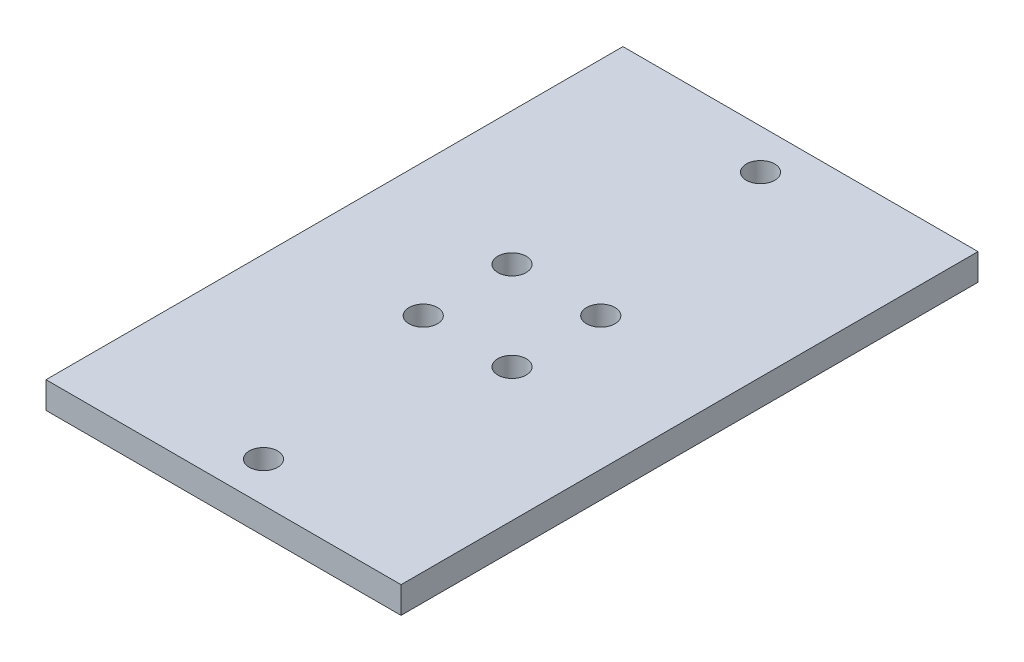
ISO-10303-21;
HEADER;
FILE_DESCRIPTION(('STEP AP214'),'2;1');
FILE_NAME('part.step','',(''),(''),'','','');
FILE_SCHEMA(('AUTOMOTIVE_DESIGN { 1 0 10303 214 1 1 1 1 }'));
ENDSEC;
DATA;
#1=APPLICATION_CONTEXT('core data for automotive mechanical design processes');
#2=APPLICATION_PROTOCOL_DEFINITION('international standard','automotive_design',2000,#1);
#3=PRODUCT_CONTEXT('',#1,'mechanical');
#4=PRODUCT('Part','Part','',(#3));
#5=PRODUCT_RELATED_PRODUCT_CATEGORY('part','',(#4));
#6=PRODUCT_DEFINITION_FORMATION('','',#4);
#7=PRODUCT_DEFINITION_CONTEXT('part definition',#1,'design');
#8=PRODUCT_DEFINITION('design','',#6,#7);
#9=PRODUCT_DEFINITION_SHAPE('','',#8);
#10=(LENGTH_UNIT() NAMED_UNIT(*) SI_UNIT(.MILLI.,.METRE.));
#11=(NAMED_UNIT(*) PLANE_ANGLE_UNIT() SI_UNIT($,.RADIAN.));
#12=(NAMED_UNIT(*) SI_UNIT($,.STERADIAN.) SOLID_ANGLE_UNIT());
#13=UNCERTAINTY_MEASURE_WITH_UNIT(LENGTH_MEASURE(1.E-05),#10,'distance_accuracy_value','');
#14=(GEOMETRIC_REPRESENTATION_CONTEXT(3) GLOBAL_UNCERTAINTY_ASSIGNED_CONTEXT((#13)) GLOBAL_UNIT_ASSIGNED_CONTEXT((#10,
#11,#12)) REPRESENTATION_CONTEXT('',''));
#15=CARTESIAN_POINT('',(0.,0.,0.));
#16=DIRECTION('',(0.,0.,1.));
#17=DIRECTION('',(1.,0.,0.));
#18=AXIS2_PLACEMENT_3D('',#15,#16,#17);
#19=CARTESIAN_POINT('',(0.,3.,0.));
#20=DIRECTION('',(0.,-1.,0.));
#21=DIRECTION('',(0.,0.,-1.));
#22=AXIS2_PLACEMENT_3D('',#19,#20,#21);
#23=PLANE('',#22);
#24=DIRECTION('',(0.,0.,-1.));
#25=VECTOR('',#24,1.);
#26=CARTESIAN_POINT('',(20.,3.,32.5));
#27=LINE('',#26,#25);
#28=CARTESIAN_POINT('',(20.,3.,32.5));
#29=VERTEX_POINT('',#28);
#30=CARTESIAN_POINT('',(20.,3.,-32.5));
#31=VERTEX_POINT('',#30);
#32=EDGE_CURVE('E93',#29,#31,#27,.T.);
#33=ORIENTED_EDGE('',*,*,#32,.T.);
#34=DIRECTION('',(-1.,0.,0.));
#35=VECTOR('',#34,1.);
#36=CARTESIAN_POINT('',(-20.,3.,-32.5));
#37=LINE('',#36,#35);
#38=CARTESIAN_POINT('',(-20.,3.,-32.5));
#39=VERTEX_POINT('',#38);
#40=EDGE_CURVE('E88',#31,#39,#37,.T.);
#41=ORIENTED_EDGE('',*,*,#40,.T.);
#42=DIRECTION('',(0.,0.,1.));
#43=VECTOR('',#42,1.);
#44=CARTESIAN_POINT('',(-20.,3.,32.5));
#45=LINE('',#44,#43);
#46=CARTESIAN_POINT('',(-20.,3.,32.5));
#47=VERTEX_POINT('',#46);
#48=EDGE_CURVE('E91',#39,#47,#45,.T.);
#49=ORIENTED_EDGE('',*,*,#48,.T.);
#50=DIRECTION('',(1.,0.,0.));
#51=VECTOR('',#50,1.);
#52=CARTESIAN_POINT('',(-20.,3.,32.5));
#53=LINE('',#52,#51);
#54=EDGE_CURVE('E58',#47,#29,#53,.T.);
#55=ORIENTED_EDGE('',*,*,#54,.T.);
#56=EDGE_LOOP('',(#33,#41,#49,#55));
#57=FACE_BOUND('',#56,.T.);
#58=CARTESIAN_POINT('',(-5.,3.,-5.));
#59=DIRECTION('',(0.,1.,0.));
#60=DIRECTION('',(0.,0.,1.));
#61=AXIS2_PLACEMENT_3D('',#58,#59,#60);
#62=CIRCLE('',#61,1.6);
#63=CARTESIAN_POINT('',(-5.,3.,-3.4));
#64=VERTEX_POINT('',#63);
#65=EDGE_CURVE('E108',#64,#64,#62,.T.);
#66=ORIENTED_EDGE('',*,*,#65,.F.);
#67=EDGE_LOOP('',(#66));
#68=FACE_BOUND('',#67,.T.);
#69=CARTESIAN_POINT('',(-5.,3.,5.));
#70=DIRECTION('',(0.,1.,0.));
#71=DIRECTION('',(0.,0.,-1.));
#72=AXIS2_PLACEMENT_3D('',#69,#70,#71);
#73=CIRCLE('',#72,1.6);
#74=CARTESIAN_POINT('',(-5.,3.,3.4));
#75=VERTEX_POINT('',#74);
#76=EDGE_CURVE('E123',#75,#75,#73,.T.);
#77=ORIENTED_EDGE('',*,*,#76,.F.);
#78=EDGE_LOOP('',(#77));
#79=FACE_BOUND('',#78,.T.);
#80=CARTESIAN_POINT('',(5.,3.,5.));
#81=DIRECTION('',(0.,1.,0.));
#82=DIRECTION('',(0.,0.,1.));
#83=AXIS2_PLACEMENT_3D('',#80,#81,#82);
#84=CIRCLE('',#83,1.6);
#85=CARTESIAN_POINT('',(5.,3.,6.6));
#86=VERTEX_POINT('',#85);
#87=EDGE_CURVE('E129',#86,#86,#84,.T.);
#88=ORIENTED_EDGE('',*,*,#87,.F.);
#89=EDGE_LOOP('',(#88));
#90=FACE_BOUND('',#89,.T.);
#91=CARTESIAN_POINT('',(5.,3.,-5.));
#92=DIRECTION('',(0.,1.,0.));
#93=DIRECTION('',(0.,0.,-1.));
#94=AXIS2_PLACEMENT_3D('',#91,#92,#93);
#95=CIRCLE('',#94,1.6);
#96=CARTESIAN_POINT('',(5.,3.,-6.6));
#97=VERTEX_POINT('',#96);
#98=EDGE_CURVE('E135',#97,#97,#95,.T.);
#99=ORIENTED_EDGE('',*,*,#98,.F.);
#100=EDGE_LOOP('',(#99));
#101=FACE_BOUND('',#100,.T.);
#102=CARTESIAN_POINT('',(0.,3.,-28.));
#103=DIRECTION('',(0.,1.,0.));
#104=DIRECTION('',(0.,0.,1.));
#105=AXIS2_PLACEMENT_3D('',#102,#103,#104);
#106=CIRCLE('',#105,1.6);
#107=CARTESIAN_POINT('',(0.,3.,-26.4));
#108=VERTEX_POINT('',#107);
#109=EDGE_CURVE('E141',#108,#108,#106,.T.);
#110=ORIENTED_EDGE('',*,*,#109,.F.);
#111=EDGE_LOOP('',(#110));
#112=FACE_BOUND('',#111,.T.);
#113=CARTESIAN_POINT('',(0.,3.,28.));
#114=DIRECTION('',(0.,1.,0.));
#115=DIRECTION('',(0.,0.,-1.));
#116=AXIS2_PLACEMENT_3D('',#113,#114,#115);
#117=CIRCLE('',#116,1.6);
#118=CARTESIAN_POINT('',(0.,3.,26.4));
#119=VERTEX_POINT('',#118);
#120=EDGE_CURVE('E147',#119,#119,#117,.T.);
#121=ORIENTED_EDGE('',*,*,#120,.F.);
#122=EDGE_LOOP('',(#121));
#123=FACE_BOUND('',#122,.T.);
#124=ADVANCED_FACE('F41',(#57,#68,#79,#90,#101,#112,#123),#23,.F.);
#125=CARTESIAN_POINT('',(0.,0.,0.));
#126=DIRECTION('',(0.,-1.,0.));
#127=DIRECTION('',(0.,0.,-1.));
#128=AXIS2_PLACEMENT_3D('',#125,#126,#127);
#129=PLANE('',#128);
#130=CARTESIAN_POINT('',(0.,0.,-28.));
#131=DIRECTION('',(0.,1.,0.));
#132=DIRECTION('',(0.,0.,1.));
#133=AXIS2_PLACEMENT_3D('',#130,#131,#132);
#134=CIRCLE('',#133,1.6);
#135=CARTESIAN_POINT('',(0.,0.,-26.4));
#136=VERTEX_POINT('',#135);
#137=EDGE_CURVE('E144',#136,#136,#134,.T.);
#138=ORIENTED_EDGE('',*,*,#137,.T.);
#139=EDGE_LOOP('',(#138));
#140=FACE_BOUND('',#139,.T.);
#141=CARTESIAN_POINT('',(5.,0.,5.));
#142=DIRECTION('',(0.,1.,0.));
#143=DIRECTION('',(0.,0.,1.));
#144=AXIS2_PLACEMENT_3D('',#141,#142,#143);
#145=CIRCLE('',#144,1.6);
#146=CARTESIAN_POINT('',(5.,0.,6.6));
#147=VERTEX_POINT('',#146);
#148=EDGE_CURVE('E132',#147,#147,#145,.T.);
#149=ORIENTED_EDGE('',*,*,#148,.T.);
#150=EDGE_LOOP('',(#149));
#151=FACE_BOUND('',#150,.T.);
#152=CARTESIAN_POINT('',(-5.,0.,-5.));
#153=DIRECTION('',(0.,1.,0.));
#154=DIRECTION('',(0.,0.,1.));
#155=AXIS2_PLACEMENT_3D('',#152,#153,#154);
#156=CIRCLE('',#155,1.6);
#157=CARTESIAN_POINT('',(-5.,0.,-3.4));
#158=VERTEX_POINT('',#157);
#159=EDGE_CURVE('E120',#158,#158,#156,.T.);
#160=ORIENTED_EDGE('',*,*,#159,.T.);
#161=EDGE_LOOP('',(#160));
#162=FACE_BOUND('',#161,.T.);
#163=DIRECTION('',(0.,0.,-1.));
#164=VECTOR('',#163,1.);
#165=CARTESIAN_POINT('',(20.,0.,32.5));
#166=LINE('',#165,#164);
#167=CARTESIAN_POINT('',(20.,0.,32.5));
#168=VERTEX_POINT('',#167);
#169=CARTESIAN_POINT('',(20.,0.,-32.5));
#170=VERTEX_POINT('',#169);
#171=EDGE_CURVE('E105',#168,#170,#166,.T.);
#172=ORIENTED_EDGE('',*,*,#171,.F.);
#173=DIRECTION('',(1.,0.,0.));
#174=VECTOR('',#173,1.);
#175=CARTESIAN_POINT('',(-20.,0.,32.5));
#176=LINE('',#175,#174);
#177=CARTESIAN_POINT('',(-20.,0.,32.5));
#178=VERTEX_POINT('',#177);
#179=EDGE_CURVE('E81',#178,#168,#176,.T.);
#180=ORIENTED_EDGE('',*,*,#179,.F.);
#181=DIRECTION('',(0.,0.,1.));
#182=VECTOR('',#181,1.);
#183=CARTESIAN_POINT('',(-20.,0.,32.5));
#184=LINE('',#183,#182);
#185=CARTESIAN_POINT('',(-20.,0.,-32.5));
#186=VERTEX_POINT('',#185);
#187=EDGE_CURVE('E75',#186,#178,#184,.T.);
#188=ORIENTED_EDGE('',*,*,#187,.F.);
#189=DIRECTION('',(-1.,0.,0.));
#190=VECTOR('',#189,1.);
#191=CARTESIAN_POINT('',(-20.,0.,-32.5));
#192=LINE('',#191,#190);
#193=EDGE_CURVE('E97',#170,#186,#192,.T.);
#194=ORIENTED_EDGE('',*,*,#193,.F.);
#195=EDGE_LOOP('',(#172,#180,#188,#194));
#196=FACE_BOUND('',#195,.T.);
#197=CARTESIAN_POINT('',(-5.,0.,5.));
#198=DIRECTION('',(0.,1.,0.));
#199=DIRECTION('',(0.,0.,-1.));
#200=AXIS2_PLACEMENT_3D('',#197,#198,#199);
#201=CIRCLE('',#200,1.6);
#202=CARTESIAN_POINT('',(-5.,0.,3.4));
#203=VERTEX_POINT('',#202);
#204=EDGE_CURVE('E126',#203,#203,#201,.T.);
#205=ORIENTED_EDGE('',*,*,#204,.T.);
#206=EDGE_LOOP('',(#205));
#207=FACE_BOUND('',#206,.T.);
#208=CARTESIAN_POINT('',(5.,0.,-5.));
#209=DIRECTION('',(0.,1.,0.));
#210=DIRECTION('',(0.,0.,-1.));
#211=AXIS2_PLACEMENT_3D('',#208,#209,#210);
#212=CIRCLE('',#211,1.6);
#213=CARTESIAN_POINT('',(5.,0.,-6.6));
#214=VERTEX_POINT('',#213);
#215=EDGE_CURVE('E138',#214,#214,#212,.T.);
#216=ORIENTED_EDGE('',*,*,#215,.T.);
#217=EDGE_LOOP('',(#216));
#218=FACE_BOUND('',#217,.T.);
#219=CARTESIAN_POINT('',(0.,0.,28.));
#220=DIRECTION('',(0.,1.,0.));
#221=DIRECTION('',(0.,0.,-1.));
#222=AXIS2_PLACEMENT_3D('',#219,#220,#221);
#223=CIRCLE('',#222,1.6);
#224=CARTESIAN_POINT('',(0.,0.,26.4));
#225=VERTEX_POINT('',#224);
#226=EDGE_CURVE('E150',#225,#225,#223,.T.);
#227=ORIENTED_EDGE('',*,*,#226,.T.);
#228=EDGE_LOOP('',(#227));
#229=FACE_BOUND('',#228,.T.);
#230=ADVANCED_FACE('F116',(#140,#151,#162,#196,#207,#218,#229),#129,.T.);
#231=CARTESIAN_POINT('',(20.,3.,32.5));
#232=DIRECTION('',(-1.,0.,0.));
#233=DIRECTION('',(0.,0.,1.));
#234=AXIS2_PLACEMENT_3D('',#231,#232,#233);
#235=PLANE('',#234);
#236=ORIENTED_EDGE('',*,*,#171,.T.);
#237=DIRECTION('',(0.,-1.,0.));
#238=VECTOR('',#237,1.);
#239=CARTESIAN_POINT('',(20.,3.,-32.5));
#240=LINE('',#239,#238);
#241=EDGE_CURVE('E11',#31,#170,#240,.T.);
#242=ORIENTED_EDGE('',*,*,#241,.F.);
#243=ORIENTED_EDGE('',*,*,#32,.F.);
#244=DIRECTION('',(0.,-1.,0.));
#245=VECTOR('',#244,1.);
#246=CARTESIAN_POINT('',(20.,3.,32.5));
#247=LINE('',#246,#245);
#248=EDGE_CURVE('E101',#29,#168,#247,.T.);
#249=ORIENTED_EDGE('',*,*,#248,.T.);
#250=EDGE_LOOP('',(#236,#242,#243,#249));
#251=FACE_BOUND('',#250,.T.);
#252=ADVANCED_FACE('F43',(#251),#235,.F.);
#253=CARTESIAN_POINT('',(-20.,3.,-32.5));
#254=DIRECTION('',(0.,0.,1.));
#255=DIRECTION('',(1.,0.,0.));
#256=AXIS2_PLACEMENT_3D('',#253,#254,#255);
#257=PLANE('',#256);
#258=ORIENTED_EDGE('',*,*,#193,.T.);
#259=DIRECTION('',(0.,-1.,0.));
#260=VECTOR('',#259,1.);
#261=CARTESIAN_POINT('',(-20.,3.,-32.5));
#262=LINE('',#261,#260);
#263=EDGE_CURVE('E50',#39,#186,#262,.T.);
#264=ORIENTED_EDGE('',*,*,#263,.F.);
#265=ORIENTED_EDGE('',*,*,#40,.F.);
#266=ORIENTED_EDGE('',*,*,#241,.T.);
#267=EDGE_LOOP('',(#258,#264,#265,#266));
#268=FACE_BOUND('',#267,.T.);
#269=ADVANCED_FACE('F96',(#268),#257,.F.);
#270=CARTESIAN_POINT('',(-20.,3.,32.5));
#271=DIRECTION('',(1.,0.,0.));
#272=DIRECTION('',(0.,0.,-1.));
#273=AXIS2_PLACEMENT_3D('',#270,#271,#272);
#274=PLANE('',#273);
#275=ORIENTED_EDGE('',*,*,#187,.T.);
#276=DIRECTION('',(0.,-1.,0.));
#277=VECTOR('',#276,1.);
#278=CARTESIAN_POINT('',(-20.,3.,32.5));
#279=LINE('',#278,#277);
#280=EDGE_CURVE('E98',#47,#178,#279,.T.);
#281=ORIENTED_EDGE('',*,*,#280,.F.);
#282=ORIENTED_EDGE('',*,*,#48,.F.);
#283=ORIENTED_EDGE('',*,*,#263,.T.);
#284=EDGE_LOOP('',(#275,#281,#282,#283));
#285=FACE_BOUND('',#284,.T.);
#286=ADVANCED_FACE('F99',(#285),#274,.F.);
#287=CARTESIAN_POINT('',(-20.,3.,32.5));
#288=DIRECTION('',(0.,0.,-1.));
#289=DIRECTION('',(-1.,0.,0.));
#290=AXIS2_PLACEMENT_3D('',#287,#288,#289);
#291=PLANE('',#290);
#292=ORIENTED_EDGE('',*,*,#179,.T.);
#293=ORIENTED_EDGE('',*,*,#248,.F.);
#294=ORIENTED_EDGE('',*,*,#54,.F.);
#295=ORIENTED_EDGE('',*,*,#280,.T.);
#296=EDGE_LOOP('',(#292,#293,#294,#295));
#297=FACE_BOUND('',#296,.T.);
#298=ADVANCED_FACE('F113',(#297),#291,.F.);
#299=CARTESIAN_POINT('',(-5.,3.,-5.));
#300=DIRECTION('',(0.,-1.,0.));
#301=DIRECTION('',(0.,0.,-1.));
#302=AXIS2_PLACEMENT_3D('',#299,#300,#301);
#303=CYLINDRICAL_SURFACE('',#302,1.6);
#304=ORIENTED_EDGE('',*,*,#65,.T.);
#305=EDGE_LOOP('',(#304));
#306=FACE_BOUND('',#305,.T.);
#307=ORIENTED_EDGE('',*,*,#159,.F.);
#308=EDGE_LOOP('',(#307));
#309=FACE_BOUND('',#308,.T.);
#310=ADVANCED_FACE('F167',(#306,#309),#303,.F.);
#311=CARTESIAN_POINT('',(-5.,3.,5.));
#312=DIRECTION('',(0.,-1.,0.));
#313=DIRECTION('',(0.,0.,-1.));
#314=AXIS2_PLACEMENT_3D('',#311,#312,#313);
#315=CYLINDRICAL_SURFACE('',#314,1.6);
#316=ORIENTED_EDGE('',*,*,#76,.T.);
#317=EDGE_LOOP('',(#316));
#318=FACE_BOUND('',#317,.T.);
#319=ORIENTED_EDGE('',*,*,#204,.F.);
#320=EDGE_LOOP('',(#319));
#321=FACE_BOUND('',#320,.T.);
#322=ADVANCED_FACE('F212',(#318,#321),#315,.F.);
#323=CARTESIAN_POINT('',(5.,3.,5.));
#324=DIRECTION('',(0.,-1.,0.));
#325=DIRECTION('',(0.,0.,-1.));
#326=AXIS2_PLACEMENT_3D('',#323,#324,#325);
#327=CYLINDRICAL_SURFACE('',#326,1.6);
#328=ORIENTED_EDGE('',*,*,#87,.T.);
#329=EDGE_LOOP('',(#328));
#330=FACE_BOUND('',#329,.T.);
#331=ORIENTED_EDGE('',*,*,#148,.F.);
#332=EDGE_LOOP('',(#331));
#333=FACE_BOUND('',#332,.T.);
#334=ADVANCED_FACE('F220',(#330,#333),#327,.F.);
#335=CARTESIAN_POINT('',(5.,3.,-5.));
#336=DIRECTION('',(0.,-1.,0.));
#337=DIRECTION('',(0.,0.,-1.));
#338=AXIS2_PLACEMENT_3D('',#335,#336,#337);
#339=CYLINDRICAL_SURFACE('',#338,1.6);
#340=ORIENTED_EDGE('',*,*,#98,.T.);
#341=EDGE_LOOP('',(#340));
#342=FACE_BOUND('',#341,.T.);
#343=ORIENTED_EDGE('',*,*,#215,.F.);
#344=EDGE_LOOP('',(#343));
#345=FACE_BOUND('',#344,.T.);
#346=ADVANCED_FACE('F228',(#342,#345),#339,.F.);
#347=CARTESIAN_POINT('',(0.,3.,-28.));
#348=DIRECTION('',(0.,-1.,0.));
#349=DIRECTION('',(0.,0.,-1.));
#350=AXIS2_PLACEMENT_3D('',#347,#348,#349);
#351=CYLINDRICAL_SURFACE('',#350,1.6);
#352=ORIENTED_EDGE('',*,*,#109,.T.);
#353=EDGE_LOOP('',(#352));
#354=FACE_BOUND('',#353,.T.);
#355=ORIENTED_EDGE('',*,*,#137,.F.);
#356=EDGE_LOOP('',(#355));
#357=FACE_BOUND('',#356,.T.);
#358=ADVANCED_FACE('F237',(#354,#357),#351,.F.);
#359=CARTESIAN_POINT('',(0.,3.,28.));
#360=DIRECTION('',(0.,-1.,0.));
#361=DIRECTION('',(0.,0.,-1.));
#362=AXIS2_PLACEMENT_3D('',#359,#360,#361);
#363=CYLINDRICAL_SURFACE('',#362,1.6);
#364=ORIENTED_EDGE('',*,*,#120,.T.);
#365=EDGE_LOOP('',(#364));
#366=FACE_BOUND('',#365,.T.);
#367=ORIENTED_EDGE('',*,*,#226,.F.);
#368=EDGE_LOOP('',(#367));
#369=FACE_BOUND('',#368,.T.);
#370=ADVANCED_FACE('F156',(#366,#369),#363,.F.);
#371=CLOSED_SHELL('',(#124,#230,#252,#269,#286,#298,#310,#322,#334,#346,#358,#370));
#372=MANIFOLD_SOLID_BREP('B2',#371);
#373=ADVANCED_BREP_SHAPE_REPRESENTATION('',(#18,#372),#14);
#374=SHAPE_DEFINITION_REPRESENTATION(#9,#373);
ENDSEC;
END-ISO-10303-21;
